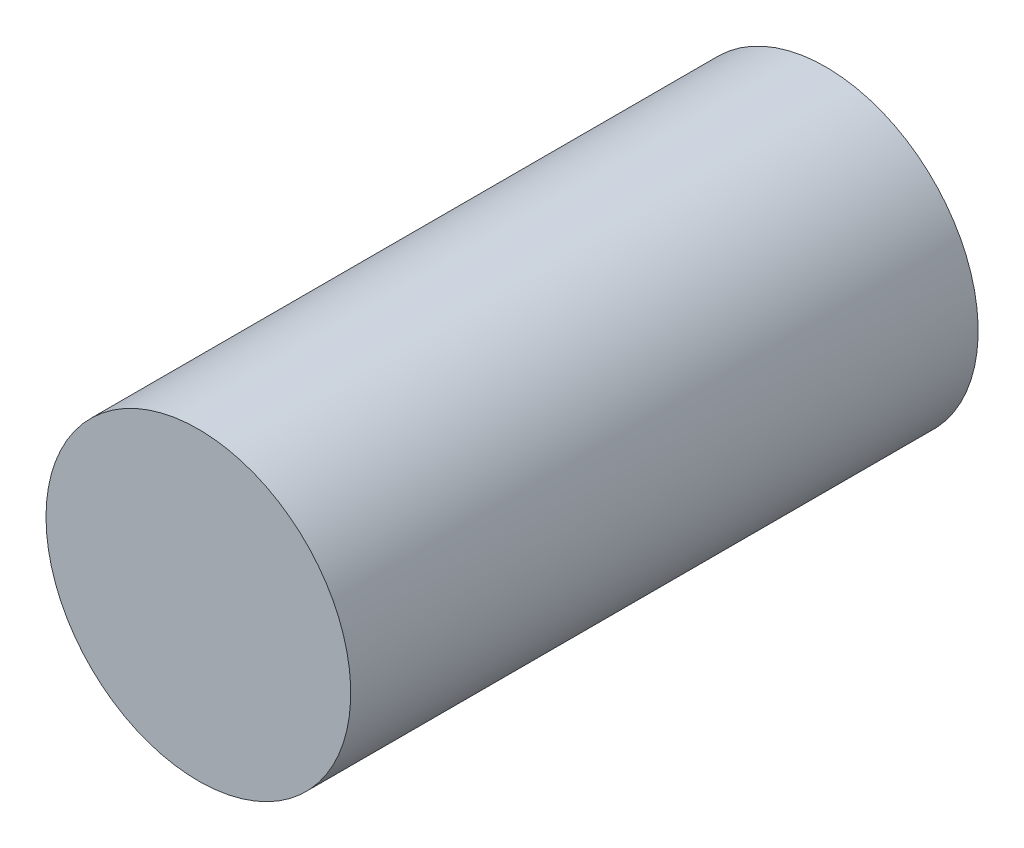
ISO-10303-21;
HEADER;
FILE_DESCRIPTION(('STEP AP214'),'2;1');
FILE_NAME('part.step','',(''),(''),'','','');
FILE_SCHEMA(('AUTOMOTIVE_DESIGN { 1 0 10303 214 1 1 1 1 }'));
ENDSEC;
DATA;
#1=APPLICATION_CONTEXT('core data for automotive mechanical design processes');
#2=APPLICATION_PROTOCOL_DEFINITION('international standard','automotive_design',2000,#1);
#3=PRODUCT_CONTEXT('',#1,'mechanical');
#4=PRODUCT('Part','Part','',(#3));
#5=PRODUCT_RELATED_PRODUCT_CATEGORY('part','',(#4));
#6=PRODUCT_DEFINITION_FORMATION('','',#4);
#7=PRODUCT_DEFINITION_CONTEXT('part definition',#1,'design');
#8=PRODUCT_DEFINITION('design','',#6,#7);
#9=PRODUCT_DEFINITION_SHAPE('','',#8);
#10=(LENGTH_UNIT() NAMED_UNIT(*) SI_UNIT(.MILLI.,.METRE.));
#11=(NAMED_UNIT(*) PLANE_ANGLE_UNIT() SI_UNIT($,.RADIAN.));
#12=(NAMED_UNIT(*) SI_UNIT($,.STERADIAN.) SOLID_ANGLE_UNIT());
#13=UNCERTAINTY_MEASURE_WITH_UNIT(LENGTH_MEASURE(1.E-05),#10,'distance_accuracy_value','');
#14=(GEOMETRIC_REPRESENTATION_CONTEXT(3) GLOBAL_UNCERTAINTY_ASSIGNED_CONTEXT((#13)) GLOBAL_UNIT_ASSIGNED_CONTEXT((#10,
#11,#12)) REPRESENTATION_CONTEXT('',''));
#15=CARTESIAN_POINT('',(0.,0.,0.));
#16=DIRECTION('',(0.,0.,1.));
#17=DIRECTION('',(1.,0.,0.));
#18=AXIS2_PLACEMENT_3D('',#15,#16,#17);
#19=CARTESIAN_POINT('',(0.,0.,7.));
#20=DIRECTION('',(0.,0.,-1.));
#21=DIRECTION('',(-1.,0.,0.));
#22=AXIS2_PLACEMENT_3D('',#19,#20,#21);
#23=CYLINDRICAL_SURFACE('',#22,1.7);
#24=CARTESIAN_POINT('',(0.,0.,7.));
#25=DIRECTION('',(0.,0.,1.));
#26=DIRECTION('',(1.,0.,0.));
#27=AXIS2_PLACEMENT_3D('',#24,#25,#26);
#28=CIRCLE('',#27,1.7);
#29=CARTESIAN_POINT('',(-1.7,0.,7.));
#30=VERTEX_POINT('',#29);
#31=EDGE_CURVE('E10',#30,#30,#28,.T.);
#32=CARTESIAN_POINT('',(0.,0.,0.));
#33=DIRECTION('',(0.,0.,1.));
#34=DIRECTION('',(1.,0.,0.));
#35=AXIS2_PLACEMENT_3D('',#32,#33,#34);
#36=CIRCLE('',#35,1.7);
#37=CARTESIAN_POINT('',(-1.7,0.,0.));
#38=VERTEX_POINT('',#37);
#39=EDGE_CURVE('E34',#38,#38,#36,.T.);
#40=CARTESIAN_POINT('',(-1.7,0.,7.));
#41=CARTESIAN_POINT('',(-1.7,0.,6.92708333333333));
#42=CARTESIAN_POINT('',(-1.7,0.,6.85416666666667));
#43=CARTESIAN_POINT('',(-1.7,0.,6.70833333333333));
#44=CARTESIAN_POINT('',(-1.7,0.,6.63541666666667));
#45=CARTESIAN_POINT('',(-1.7,0.,6.48958333333333));
#46=CARTESIAN_POINT('',(-1.7,0.,6.41666666666667));
#47=CARTESIAN_POINT('',(-1.7,0.,6.27083333333333));
#48=CARTESIAN_POINT('',(-1.7,0.,6.19791666666667));
#49=CARTESIAN_POINT('',(-1.7,0.,6.05208333333333));
#50=CARTESIAN_POINT('',(-1.7,0.,5.97916666666667));
#51=CARTESIAN_POINT('',(-1.7,0.,5.83333333333333));
#52=CARTESIAN_POINT('',(-1.7,0.,5.76041666666667));
#53=CARTESIAN_POINT('',(-1.7,0.,5.61458333333333));
#54=CARTESIAN_POINT('',(-1.7,0.,5.54166666666667));
#55=CARTESIAN_POINT('',(-1.7,0.,5.39583333333333));
#56=CARTESIAN_POINT('',(-1.7,0.,5.32291666666667));
#57=CARTESIAN_POINT('',(-1.7,0.,5.17708333333333));
#58=CARTESIAN_POINT('',(-1.7,0.,5.10416666666667));
#59=CARTESIAN_POINT('',(-1.7,0.,4.95833333333333));
#60=CARTESIAN_POINT('',(-1.7,0.,4.88541666666667));
#61=CARTESIAN_POINT('',(-1.7,0.,4.73958333333333));
#62=CARTESIAN_POINT('',(-1.7,0.,4.66666666666667));
#63=CARTESIAN_POINT('',(-1.7,0.,4.52083333333333));
#64=CARTESIAN_POINT('',(-1.7,0.,4.44791666666667));
#65=CARTESIAN_POINT('',(-1.7,0.,4.30208333333333));
#66=CARTESIAN_POINT('',(-1.7,0.,4.22916666666667));
#67=CARTESIAN_POINT('',(-1.7,0.,4.08333333333333));
#68=CARTESIAN_POINT('',(-1.7,0.,4.01041666666667));
#69=CARTESIAN_POINT('',(-1.7,0.,3.86458333333333));
#70=CARTESIAN_POINT('',(-1.7,0.,3.79166666666667));
#71=CARTESIAN_POINT('',(-1.7,0.,3.64583333333333));
#72=CARTESIAN_POINT('',(-1.7,0.,3.57291666666667));
#73=CARTESIAN_POINT('',(-1.7,0.,3.42708333333333));
#74=CARTESIAN_POINT('',(-1.7,0.,3.35416666666667));
#75=CARTESIAN_POINT('',(-1.7,0.,3.20833333333333));
#76=CARTESIAN_POINT('',(-1.7,0.,3.13541666666667));
#77=CARTESIAN_POINT('',(-1.7,0.,2.98958333333333));
#78=CARTESIAN_POINT('',(-1.7,0.,2.91666666666667));
#79=CARTESIAN_POINT('',(-1.7,0.,2.77083333333333));
#80=CARTESIAN_POINT('',(-1.7,0.,2.69791666666667));
#81=CARTESIAN_POINT('',(-1.7,0.,2.55208333333333));
#82=CARTESIAN_POINT('',(-1.7,0.,2.47916666666667));
#83=CARTESIAN_POINT('',(-1.7,0.,2.33333333333333));
#84=CARTESIAN_POINT('',(-1.7,0.,2.26041666666667));
#85=CARTESIAN_POINT('',(-1.7,0.,2.11458333333333));
#86=CARTESIAN_POINT('',(-1.7,0.,2.04166666666667));
#87=CARTESIAN_POINT('',(-1.7,0.,1.89583333333333));
#88=CARTESIAN_POINT('',(-1.7,0.,1.82291666666667));
#89=CARTESIAN_POINT('',(-1.7,0.,1.67708333333333));
#90=CARTESIAN_POINT('',(-1.7,0.,1.60416666666667));
#91=CARTESIAN_POINT('',(-1.7,0.,1.45833333333333));
#92=CARTESIAN_POINT('',(-1.7,0.,1.38541666666667));
#93=CARTESIAN_POINT('',(-1.7,0.,1.23958333333333));
#94=CARTESIAN_POINT('',(-1.7,0.,1.16666666666667));
#95=CARTESIAN_POINT('',(-1.7,0.,1.02083333333333));
#96=CARTESIAN_POINT('',(-1.7,0.,0.947916666666666));
#97=CARTESIAN_POINT('',(-1.7,0.,0.802083333333332));
#98=CARTESIAN_POINT('',(-1.7,0.,0.729166666666666));
#99=CARTESIAN_POINT('',(-1.7,0.,0.583333333333332));
#100=CARTESIAN_POINT('',(-1.7,0.,0.510416666666666));
#101=CARTESIAN_POINT('',(-1.7,0.,0.364583333333333));
#102=CARTESIAN_POINT('',(-1.7,0.,0.291666666666666));
#103=CARTESIAN_POINT('',(-1.7,0.,0.145833333333333));
#104=CARTESIAN_POINT('',(-1.7,0.,0.0729166666666657));
#105=CARTESIAN_POINT('',(-1.7,0.,0.));
#106=B_SPLINE_CURVE_WITH_KNOTS('',3,(#40,#41,#42,#43,#44,#45,#46,#47,#48,#49,#50,#51,#52,#53,
#54,#55,#56,#57,#58,#59,#60,#61,#62,#63,#64,#65,#66,#67,#68,#69,#70,#71,#72,#73,#74,#75,#76,#77,
#78,#79,#80,#81,#82,#83,#84,#85,#86,#87,#88,#89,#90,#91,#92,#93,#94,#95,#96,#97,#98,#99,#100,
#101,#102,#103,#104,#105),.UNSPECIFIED.,.F.,.F.,(4,2,2,2,2,2,2,2,2,2,2,2,2,2,2,2,2,2,2,2,2,2,2,
2,2,2,2,2,2,2,2,2,4),(0.,0.218749999999999,0.4375,0.65625,0.875,1.09375,1.3125,1.53125,1.75,
1.96875,2.1875,2.40625,2.625,2.84375,3.0625,3.28125,3.5,3.71875,3.9375,4.15625,4.375,4.59375,
4.8125,5.03125,5.25,5.46875,5.6875,5.90625,6.125,6.34375,6.5625,6.78125,7.),.UNSPECIFIED.);
#107=EDGE_CURVE('BSEAM31',#30,#38,#106,.T.);
#108=ORIENTED_EDGE('',*,*,#31,.F.);
#109=ORIENTED_EDGE('',*,*,#39,.T.);
#110=ORIENTED_EDGE('',*,*,#107,.T.);
#111=ORIENTED_EDGE('',*,*,#107,.F.);
#112=EDGE_LOOP('',(#108,#110,#109,#111));
#113=FACE_BOUND('',#112,.T.);
#114=ADVANCED_FACE('F31',(#113),#23,.T.);
#115=CARTESIAN_POINT('',(0.,0.,7.));
#116=DIRECTION('',(0.,0.,1.));
#117=DIRECTION('',(1.,0.,0.));
#118=AXIS2_PLACEMENT_3D('',#115,#116,#117);
#119=PLANE('',#118);
#120=ORIENTED_EDGE('',*,*,#31,.T.);
#121=EDGE_LOOP('',(#120));
#122=FACE_BOUND('',#121,.T.);
#123=ADVANCED_FACE('F46',(#122),#119,.T.);
#124=CARTESIAN_POINT('',(0.,0.,0.));
#125=DIRECTION('',(0.,0.,1.));
#126=DIRECTION('',(1.,0.,0.));
#127=AXIS2_PLACEMENT_3D('',#124,#125,#126);
#128=PLANE('',#127);
#129=ORIENTED_EDGE('',*,*,#39,.F.);
#130=EDGE_LOOP('',(#129));
#131=FACE_BOUND('',#130,.T.);
#132=ADVANCED_FACE('F44',(#131),#128,.F.);
#133=CLOSED_SHELL('',(#114,#123,#132));
#134=MANIFOLD_SOLID_BREP('B2',#133);
#135=ADVANCED_BREP_SHAPE_REPRESENTATION('',(#18,#134),#14);
#136=SHAPE_DEFINITION_REPRESENTATION(#9,#135);
ENDSEC;
END-ISO-10303-21;
